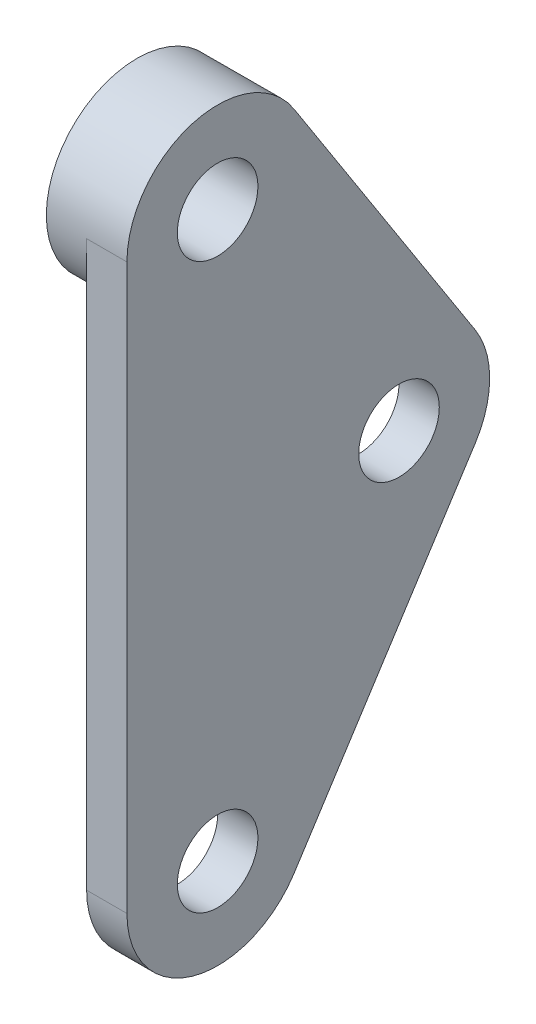
ISO-10303-21;
HEADER;
FILE_DESCRIPTION(('STEP AP214'),'2;1');
FILE_NAME('part.step','',(''),(''),'','','');
FILE_SCHEMA(('AUTOMOTIVE_DESIGN { 1 0 10303 214 1 1 1 1 }'));
ENDSEC;
DATA;
#1=APPLICATION_CONTEXT('core data for automotive mechanical design processes');
#2=APPLICATION_PROTOCOL_DEFINITION('international standard','automotive_design',2000,#1);
#3=PRODUCT_CONTEXT('',#1,'mechanical');
#4=PRODUCT('Part','Part','',(#3));
#5=PRODUCT_RELATED_PRODUCT_CATEGORY('part','',(#4));
#6=PRODUCT_DEFINITION_FORMATION('','',#4);
#7=PRODUCT_DEFINITION_CONTEXT('part definition',#1,'design');
#8=PRODUCT_DEFINITION('design','',#6,#7);
#9=PRODUCT_DEFINITION_SHAPE('','',#8);
#10=(LENGTH_UNIT() NAMED_UNIT(*) SI_UNIT(.MILLI.,.METRE.));
#11=(NAMED_UNIT(*) PLANE_ANGLE_UNIT() SI_UNIT($,.RADIAN.));
#12=(NAMED_UNIT(*) SI_UNIT($,.STERADIAN.) SOLID_ANGLE_UNIT());
#13=UNCERTAINTY_MEASURE_WITH_UNIT(LENGTH_MEASURE(1.E-05),#10,'distance_accuracy_value','');
#14=(GEOMETRIC_REPRESENTATION_CONTEXT(3) GLOBAL_UNCERTAINTY_ASSIGNED_CONTEXT((#13)) GLOBAL_UNIT_ASSIGNED_CONTEXT((#10,
#11,#12)) REPRESENTATION_CONTEXT('',''));
#15=CARTESIAN_POINT('',(0.,0.,0.));
#16=DIRECTION('',(0.,0.,1.));
#17=DIRECTION('',(1.,0.,0.));
#18=AXIS2_PLACEMENT_3D('',#15,#16,#17);
#19=CARTESIAN_POINT('',(2.,3.16445609231869,-4.92248725471796));
#20=DIRECTION('',(0.,0.540757591313499,-0.841178475376554));
#21=DIRECTION('',(0.,0.841178475376554,0.540757591313499));
#22=AXIS2_PLACEMENT_3D('',#19,#20,#21);
#23=PLANE('',#22);
#24=DIRECTION('',(0.,-0.841178475376554,-0.540757591313499));
#25=VECTOR('',#24,1.);
#26=CARTESIAN_POINT('',(0.,3.16445609231869,-4.92248725471796));
#27=LINE('',#26,#25);
#28=CARTESIAN_POINT('',(0.,-2.06659083908926,-8.28530313919449));
#29=VERTEX_POINT('',#28);
#30=CARTESIAN_POINT('',(0.,-16.0665908390893,-17.2853031391945));
#31=VERTEX_POINT('',#30);
#32=EDGE_CURVE('E196',#29,#31,#27,.T.);
#33=ORIENTED_EDGE('',*,*,#32,.F.);
#34=DIRECTION('',(-1.,0.,0.));
#35=VECTOR('',#34,1.);
#36=CARTESIAN_POINT('',(2.,-2.06659083908926,-8.28530313919449));
#37=LINE('',#36,#35);
#38=CARTESIAN_POINT('',(2.,-2.06659083908926,-8.28530313919449));
#39=VERTEX_POINT('',#38);
#40=EDGE_CURVE('E211',#39,#29,#37,.T.);
#41=ORIENTED_EDGE('',*,*,#40,.F.);
#42=DIRECTION('',(0.,-0.841178475376554,-0.540757591313499));
#43=VECTOR('',#42,1.);
#44=CARTESIAN_POINT('',(2.,3.16445609231869,-4.92248725471796));
#45=LINE('',#44,#43);
#46=CARTESIAN_POINT('',(2.,-16.0665908390893,-17.2853031391945));
#47=VERTEX_POINT('',#46);
#48=EDGE_CURVE('E187',#39,#47,#45,.T.);
#49=ORIENTED_EDGE('',*,*,#48,.T.);
#50=DIRECTION('',(-1.,0.,0.));
#51=VECTOR('',#50,1.);
#52=CARTESIAN_POINT('',(2.,-16.0665908390893,-17.2853031391945));
#53=LINE('',#52,#51);
#54=EDGE_CURVE('E115',#47,#31,#53,.T.);
#55=ORIENTED_EDGE('',*,*,#54,.T.);
#56=EDGE_LOOP('',(#33,#41,#49,#55));
#57=FACE_BOUND('',#56,.T.);
#58=ADVANCED_FACE('F104',(#57),#23,.T.);
#59=CARTESIAN_POINT('',(2.,0.,0.));
#60=DIRECTION('',(0.,0.,-1.));
#61=DIRECTION('',(-1.,0.,0.));
#62=AXIS2_PLACEMENT_3D('',#59,#60,#61);
#63=PLANE('',#62);
#64=DIRECTION('',(0.,-1.,0.));
#65=VECTOR('',#64,1.);
#66=CARTESIAN_POINT('',(0.,0.,0.));
#67=LINE('',#66,#65);
#68=CARTESIAN_POINT('',(0.,-4.5,0.));
#69=VERTEX_POINT('',#68);
#70=CARTESIAN_POINT('',(0.,-32.5,0.));
#71=VERTEX_POINT('',#70);
#72=EDGE_CURVE('E168',#69,#71,#67,.T.);
#73=ORIENTED_EDGE('',*,*,#72,.T.);
#74=DIRECTION('',(-1.,0.,0.));
#75=VECTOR('',#74,1.);
#76=CARTESIAN_POINT('',(2.,-32.5,0.));
#77=LINE('',#76,#75);
#78=CARTESIAN_POINT('',(2.,-32.5,0.));
#79=VERTEX_POINT('',#78);
#80=EDGE_CURVE('E161',#79,#71,#77,.T.);
#81=ORIENTED_EDGE('',*,*,#80,.F.);
#82=DIRECTION('',(0.,-1.,0.));
#83=VECTOR('',#82,1.);
#84=CARTESIAN_POINT('',(2.,0.,0.));
#85=LINE('',#84,#83);
#86=CARTESIAN_POINT('',(2.,-4.5,0.));
#87=VERTEX_POINT('',#86);
#88=EDGE_CURVE('E166',#87,#79,#85,.T.);
#89=ORIENTED_EDGE('',*,*,#88,.F.);
#90=DIRECTION('',(-1.,0.,0.));
#91=VECTOR('',#90,1.);
#92=CARTESIAN_POINT('',(2.,-4.5,0.));
#93=LINE('',#92,#91);
#94=EDGE_CURVE('E172',#87,#69,#93,.T.);
#95=ORIENTED_EDGE('',*,*,#94,.T.);
#96=EDGE_LOOP('',(#73,#81,#89,#95));
#97=FACE_BOUND('',#96,.T.);
#98=ADVANCED_FACE('F163',(#97),#63,.F.);
#99=CARTESIAN_POINT('',(2.,-13.9839506771562,-21.7528121644653));
#100=DIRECTION('',(0.,-0.540757591313499,-0.841178475376554));
#101=DIRECTION('',(0.,0.841178475376554,-0.540757591313499));
#102=AXIS2_PLACEMENT_3D('',#99,#100,#101);
#103=PLANE('',#102);
#104=DIRECTION('',(0.,-0.841178475376554,0.540757591313499));
#105=VECTOR('',#104,1.);
#106=CARTESIAN_POINT('',(0.,-13.9839506771562,-21.7528121644653));
#107=LINE('',#106,#105);
#108=CARTESIAN_POINT('',(0.,-20.9334091609107,-17.2853031391945));
#109=VERTEX_POINT('',#108);
#110=CARTESIAN_POINT('',(0.,-34.9334091609107,-8.28530313919449));
#111=VERTEX_POINT('',#110);
#112=EDGE_CURVE('E193',#109,#111,#107,.T.);
#113=ORIENTED_EDGE('',*,*,#112,.F.);
#114=DIRECTION('',(-1.,0.,0.));
#115=VECTOR('',#114,1.);
#116=CARTESIAN_POINT('',(2.,-20.9334091609107,-17.2853031391945));
#117=LINE('',#116,#115);
#118=CARTESIAN_POINT('',(2.,-20.9334091609107,-17.2853031391945));
#119=VERTEX_POINT('',#118);
#120=EDGE_CURVE('E124',#119,#109,#117,.T.);
#121=ORIENTED_EDGE('',*,*,#120,.F.);
#122=DIRECTION('',(0.,-0.841178475376554,0.540757591313499));
#123=VECTOR('',#122,1.);
#124=CARTESIAN_POINT('',(2.,-13.9839506771562,-21.7528121644653));
#125=LINE('',#124,#123);
#126=CARTESIAN_POINT('',(2.,-34.9334091609107,-8.28530313919449));
#127=VERTEX_POINT('',#126);
#128=EDGE_CURVE('E186',#119,#127,#125,.T.);
#129=ORIENTED_EDGE('',*,*,#128,.T.);
#130=DIRECTION('',(-1.,0.,0.));
#131=VECTOR('',#130,1.);
#132=CARTESIAN_POINT('',(2.,-34.9334091609107,-8.28530313919449));
#133=LINE('',#132,#131);
#134=EDGE_CURVE('E141',#127,#111,#133,.T.);
#135=ORIENTED_EDGE('',*,*,#134,.T.);
#136=EDGE_LOOP('',(#113,#121,#129,#135));
#137=FACE_BOUND('',#136,.T.);
#138=ADVANCED_FACE('F229',(#137),#103,.T.);
#139=CARTESIAN_POINT('',(0.,0.,0.));
#140=DIRECTION('',(1.,0.,0.));
#141=DIRECTION('',(0.,0.,-1.));
#142=AXIS2_PLACEMENT_3D('',#139,#140,#141);
#143=PLANE('',#142);
#144=CARTESIAN_POINT('',(0.,-18.5,-13.5));
#145=DIRECTION('',(1.,0.,0.));
#146=DIRECTION('',(0.,0.,-1.));
#147=AXIS2_PLACEMENT_3D('',#144,#145,#146);
#148=CIRCLE('',#147,2.);
#149=CARTESIAN_POINT('',(0.,-18.5,-15.5));
#150=VERTEX_POINT('',#149);
#151=EDGE_CURVE('E301',#150,#150,#148,.F.);
#152=ORIENTED_EDGE('',*,*,#151,.F.);
#153=EDGE_LOOP('',(#152));
#154=FACE_BOUND('',#153,.T.);
#155=CARTESIAN_POINT('',(0.,-32.5,-4.5));
#156=DIRECTION('',(1.,0.,0.));
#157=DIRECTION('',(0.,0.,-1.));
#158=AXIS2_PLACEMENT_3D('',#155,#156,#157);
#159=CIRCLE('',#158,2.);
#160=CARTESIAN_POINT('',(0.,-32.5,-6.5));
#161=VERTEX_POINT('',#160);
#162=EDGE_CURVE('E289',#161,#161,#159,.F.);
#163=ORIENTED_EDGE('',*,*,#162,.F.);
#164=EDGE_LOOP('',(#163));
#165=FACE_BOUND('',#164,.T.);
#166=ORIENTED_EDGE('',*,*,#72,.F.);
#167=CARTESIAN_POINT('',(0.,-4.5,-4.5));
#168=DIRECTION('',(1.,0.,0.));
#169=DIRECTION('',(0.,0.,-1.));
#170=AXIS2_PLACEMENT_3D('',#167,#168,#169);
#171=CIRCLE('',#170,4.5);
#172=EDGE_CURVE('E12',#69,#29,#171,.T.);
#173=ORIENTED_EDGE('',*,*,#172,.T.);
#174=ORIENTED_EDGE('',*,*,#32,.T.);
#175=CARTESIAN_POINT('',(0.,-18.5,-13.5));
#176=DIRECTION('',(1.,0.,0.));
#177=DIRECTION('',(0.,0.,-1.));
#178=AXIS2_PLACEMENT_3D('',#175,#176,#177);
#179=CIRCLE('',#178,4.5);
#180=EDGE_CURVE('E179',#109,#31,#179,.T.);
#181=ORIENTED_EDGE('',*,*,#180,.F.);
#182=ORIENTED_EDGE('',*,*,#112,.T.);
#183=CARTESIAN_POINT('',(0.,-32.5,-4.5));
#184=DIRECTION('',(1.,0.,0.));
#185=DIRECTION('',(0.,0.,-1.));
#186=AXIS2_PLACEMENT_3D('',#183,#184,#185);
#187=CIRCLE('',#186,4.5);
#188=EDGE_CURVE('E108',#71,#111,#187,.T.);
#189=ORIENTED_EDGE('',*,*,#188,.F.);
#190=EDGE_LOOP('',(#166,#173,#174,#181,#182,#189));
#191=FACE_BOUND('',#190,.T.);
#192=ADVANCED_FACE('F226',(#154,#165,#191),#143,.F.);
#193=CARTESIAN_POINT('',(2.,0.,0.));
#194=DIRECTION('',(1.,0.,0.));
#195=DIRECTION('',(0.,0.,-1.));
#196=AXIS2_PLACEMENT_3D('',#193,#194,#195);
#197=PLANE('',#196);
#198=CARTESIAN_POINT('',(2.,-4.5,-4.5));
#199=DIRECTION('',(1.,0.,0.));
#200=DIRECTION('',(0.,0.,-1.));
#201=AXIS2_PLACEMENT_3D('',#198,#199,#200);
#202=CIRCLE('',#201,2.);
#203=CARTESIAN_POINT('',(2.,-4.5,-6.5));
#204=VERTEX_POINT('',#203);
#205=EDGE_CURVE('E280',#204,#204,#202,.T.);
#206=ORIENTED_EDGE('',*,*,#205,.F.);
#207=EDGE_LOOP('',(#206));
#208=FACE_BOUND('',#207,.T.);
#209=CARTESIAN_POINT('',(2.,-18.5,-13.5));
#210=DIRECTION('',(1.,0.,0.));
#211=DIRECTION('',(0.,0.,-1.));
#212=AXIS2_PLACEMENT_3D('',#209,#210,#211);
#213=CIRCLE('',#212,2.);
#214=CARTESIAN_POINT('',(2.,-18.5,-15.5));
#215=VERTEX_POINT('',#214);
#216=EDGE_CURVE('E285',#215,#215,#213,.T.);
#217=ORIENTED_EDGE('',*,*,#216,.F.);
#218=EDGE_LOOP('',(#217));
#219=FACE_BOUND('',#218,.T.);
#220=CARTESIAN_POINT('',(2.,-32.5,-4.5));
#221=DIRECTION('',(1.,0.,0.));
#222=DIRECTION('',(0.,0.,-1.));
#223=AXIS2_PLACEMENT_3D('',#220,#221,#222);
#224=CIRCLE('',#223,2.);
#225=CARTESIAN_POINT('',(2.,-32.5,-6.5));
#226=VERTEX_POINT('',#225);
#227=EDGE_CURVE('E292',#226,#226,#224,.T.);
#228=ORIENTED_EDGE('',*,*,#227,.F.);
#229=EDGE_LOOP('',(#228));
#230=FACE_BOUND('',#229,.T.);
#231=ORIENTED_EDGE('',*,*,#128,.F.);
#232=CARTESIAN_POINT('',(2.,-18.5,-13.5));
#233=DIRECTION('',(1.,0.,0.));
#234=DIRECTION('',(0.,0.,-1.));
#235=AXIS2_PLACEMENT_3D('',#232,#233,#234);
#236=CIRCLE('',#235,4.5);
#237=EDGE_CURVE('E219',#119,#47,#236,.T.);
#238=ORIENTED_EDGE('',*,*,#237,.T.);
#239=ORIENTED_EDGE('',*,*,#48,.F.);
#240=CARTESIAN_POINT('',(2.,-4.5,-4.5));
#241=DIRECTION('',(1.,0.,0.));
#242=DIRECTION('',(0.,0.,-1.));
#243=AXIS2_PLACEMENT_3D('',#240,#241,#242);
#244=CIRCLE('',#243,4.5);
#245=EDGE_CURVE('E184',#39,#87,#244,.T.);
#246=ORIENTED_EDGE('',*,*,#245,.T.);
#247=ORIENTED_EDGE('',*,*,#88,.T.);
#248=CARTESIAN_POINT('',(2.,-32.5,-4.5));
#249=DIRECTION('',(1.,0.,0.));
#250=DIRECTION('',(0.,0.,-1.));
#251=AXIS2_PLACEMENT_3D('',#248,#249,#250);
#252=CIRCLE('',#251,4.5);
#253=EDGE_CURVE('E175',#79,#127,#252,.T.);
#254=ORIENTED_EDGE('',*,*,#253,.T.);
#255=EDGE_LOOP('',(#231,#238,#239,#246,#247,#254));
#256=FACE_BOUND('',#255,.T.);
#257=ADVANCED_FACE('F181',(#208,#219,#230,#256),#197,.T.);
#258=CARTESIAN_POINT('',(2.,-32.5,-4.5));
#259=DIRECTION('',(-1.,0.,0.));
#260=DIRECTION('',(0.,0.,1.));
#261=AXIS2_PLACEMENT_3D('',#258,#259,#260);
#262=CYLINDRICAL_SURFACE('',#261,4.5);
#263=ORIENTED_EDGE('',*,*,#253,.F.);
#264=ORIENTED_EDGE('',*,*,#80,.T.);
#265=ORIENTED_EDGE('',*,*,#188,.T.);
#266=ORIENTED_EDGE('',*,*,#134,.F.);
#267=EDGE_LOOP('',(#263,#264,#265,#266));
#268=FACE_BOUND('',#267,.T.);
#269=ADVANCED_FACE('F106',(#268),#262,.T.);
#270=CARTESIAN_POINT('',(2.,-18.5,-13.5));
#271=DIRECTION('',(-1.,0.,0.));
#272=DIRECTION('',(0.,0.,1.));
#273=AXIS2_PLACEMENT_3D('',#270,#271,#272);
#274=CYLINDRICAL_SURFACE('',#273,4.5);
#275=ORIENTED_EDGE('',*,*,#180,.T.);
#276=ORIENTED_EDGE('',*,*,#54,.F.);
#277=ORIENTED_EDGE('',*,*,#237,.F.);
#278=ORIENTED_EDGE('',*,*,#120,.T.);
#279=EDGE_LOOP('',(#275,#276,#277,#278));
#280=FACE_BOUND('',#279,.T.);
#281=ADVANCED_FACE('F223',(#280),#274,.T.);
#282=CARTESIAN_POINT('',(2.,-4.5,-4.5));
#283=DIRECTION('',(-1.,0.,0.));
#284=DIRECTION('',(0.,0.,1.));
#285=AXIS2_PLACEMENT_3D('',#282,#283,#284);
#286=CYLINDRICAL_SURFACE('',#285,4.5);
#287=ORIENTED_EDGE('',*,*,#245,.F.);
#288=ORIENTED_EDGE('',*,*,#40,.T.);
#289=ORIENTED_EDGE('',*,*,#172,.F.);
#290=ORIENTED_EDGE('',*,*,#94,.F.);
#291=EDGE_LOOP('',(#287,#288,#289,#290));
#292=FACE_BOUND('',#291,.T.);
#293=CARTESIAN_POINT('',(-2.,-4.5,-4.5));
#294=DIRECTION('',(1.,0.,0.));
#295=DIRECTION('',(0.,0.,-1.));
#296=AXIS2_PLACEMENT_3D('',#293,#294,#295);
#297=CIRCLE('',#296,4.5);
#298=CARTESIAN_POINT('',(-2.,-4.5,-9.));
#299=VERTEX_POINT('',#298);
#300=EDGE_CURVE('E305',#299,#299,#297,.T.);
#301=ORIENTED_EDGE('',*,*,#300,.T.);
#302=EDGE_LOOP('',(#301));
#303=FACE_BOUND('',#302,.T.);
#304=ADVANCED_FACE('F244',(#292,#303),#286,.T.);
#305=CARTESIAN_POINT('',(-2.,-4.5,-4.5));
#306=DIRECTION('',(1.,0.,0.));
#307=DIRECTION('',(0.,0.,-1.));
#308=AXIS2_PLACEMENT_3D('',#305,#306,#307);
#309=PLANE('',#308);
#310=CARTESIAN_POINT('',(-2.,-4.5,-4.5));
#311=DIRECTION('',(1.,0.,0.));
#312=DIRECTION('',(0.,0.,-1.));
#313=AXIS2_PLACEMENT_3D('',#310,#311,#312);
#314=CIRCLE('',#313,2.);
#315=CARTESIAN_POINT('',(-2.,-4.5,-6.5));
#316=VERTEX_POINT('',#315);
#317=EDGE_CURVE('E283',#316,#316,#314,.T.);
#318=ORIENTED_EDGE('',*,*,#317,.T.);
#319=EDGE_LOOP('',(#318));
#320=FACE_BOUND('',#319,.T.);
#321=ORIENTED_EDGE('',*,*,#300,.F.);
#322=EDGE_LOOP('',(#321));
#323=FACE_BOUND('',#322,.T.);
#324=ADVANCED_FACE('F246',(#320,#323),#309,.F.);
#325=CARTESIAN_POINT('',(2.,-4.5,-4.5));
#326=DIRECTION('',(-1.,0.,0.));
#327=DIRECTION('',(0.,0.,1.));
#328=AXIS2_PLACEMENT_3D('',#325,#326,#327);
#329=CYLINDRICAL_SURFACE('',#328,2.);
#330=ORIENTED_EDGE('',*,*,#205,.T.);
#331=EDGE_LOOP('',(#330));
#332=FACE_BOUND('',#331,.T.);
#333=ORIENTED_EDGE('',*,*,#317,.F.);
#334=EDGE_LOOP('',(#333));
#335=FACE_BOUND('',#334,.T.);
#336=ADVANCED_FACE('F264',(#332,#335),#329,.F.);
#337=CARTESIAN_POINT('',(2.,-32.5,-4.5));
#338=DIRECTION('',(-1.,0.,0.));
#339=DIRECTION('',(0.,0.,1.));
#340=AXIS2_PLACEMENT_3D('',#337,#338,#339);
#341=CYLINDRICAL_SURFACE('',#340,2.);
#342=ORIENTED_EDGE('',*,*,#227,.T.);
#343=EDGE_LOOP('',(#342));
#344=FACE_BOUND('',#343,.T.);
#345=ORIENTED_EDGE('',*,*,#162,.T.);
#346=EDGE_LOOP('',(#345));
#347=FACE_BOUND('',#346,.T.);
#348=ADVANCED_FACE('F266',(#344,#347),#341,.F.);
#349=CARTESIAN_POINT('',(2.,-18.5,-13.5));
#350=DIRECTION('',(-1.,0.,0.));
#351=DIRECTION('',(0.,0.,1.));
#352=AXIS2_PLACEMENT_3D('',#349,#350,#351);
#353=CYLINDRICAL_SURFACE('',#352,2.);
#354=ORIENTED_EDGE('',*,*,#216,.T.);
#355=EDGE_LOOP('',(#354));
#356=FACE_BOUND('',#355,.T.);
#357=ORIENTED_EDGE('',*,*,#151,.T.);
#358=EDGE_LOOP('',(#357));
#359=FACE_BOUND('',#358,.T.);
#360=ADVANCED_FACE('F269',(#356,#359),#353,.F.);
#361=CLOSED_SHELL('',(#58,#98,#138,#192,#257,#269,#281,#304,#324,#336,#348,#360));
#362=MANIFOLD_SOLID_BREP('B2',#361);
#363=ADVANCED_BREP_SHAPE_REPRESENTATION('',(#18,#362),#14);
#364=SHAPE_DEFINITION_REPRESENTATION(#9,#363);
ENDSEC;
END-ISO-10303-21;
